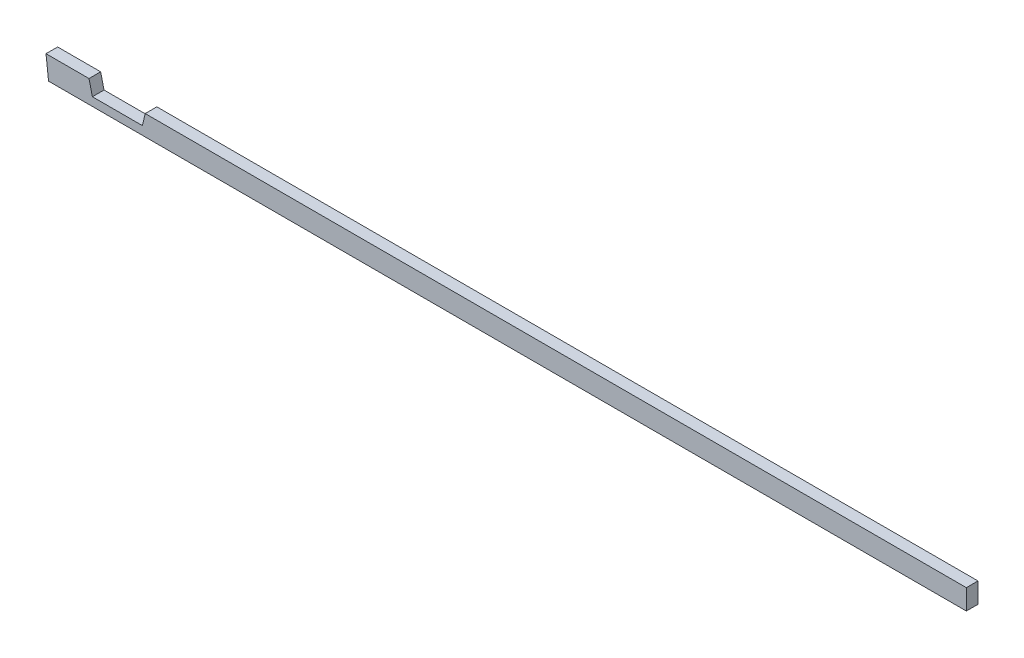
ISO-10303-21;
HEADER;
FILE_DESCRIPTION(('STEP AP214'),'2;1');
FILE_NAME('part.step','',(''),(''),'','','');
FILE_SCHEMA(('AUTOMOTIVE_DESIGN { 1 0 10303 214 1 1 1 1 }'));
ENDSEC;
DATA;
#1=APPLICATION_CONTEXT('core data for automotive mechanical design processes');
#2=APPLICATION_PROTOCOL_DEFINITION('international standard','automotive_design',2000,#1);
#3=PRODUCT_CONTEXT('',#1,'mechanical');
#4=PRODUCT('Part','Part','',(#3));
#5=PRODUCT_RELATED_PRODUCT_CATEGORY('part','',(#4));
#6=PRODUCT_DEFINITION_FORMATION('','',#4);
#7=PRODUCT_DEFINITION_CONTEXT('part definition',#1,'design');
#8=PRODUCT_DEFINITION('design','',#6,#7);
#9=PRODUCT_DEFINITION_SHAPE('','',#8);
#10=(LENGTH_UNIT() NAMED_UNIT(*) SI_UNIT(.MILLI.,.METRE.));
#11=(NAMED_UNIT(*) PLANE_ANGLE_UNIT() SI_UNIT($,.RADIAN.));
#12=(NAMED_UNIT(*) SI_UNIT($,.STERADIAN.) SOLID_ANGLE_UNIT());
#13=UNCERTAINTY_MEASURE_WITH_UNIT(LENGTH_MEASURE(1.E-05),#10,'distance_accuracy_value','');
#14=(GEOMETRIC_REPRESENTATION_CONTEXT(3) GLOBAL_UNCERTAINTY_ASSIGNED_CONTEXT((#13)) GLOBAL_UNIT_ASSIGNED_CONTEXT((#10,
#11,#12)) REPRESENTATION_CONTEXT('',''));
#15=CARTESIAN_POINT('',(0.,0.,0.));
#16=DIRECTION('',(0.,0.,1.));
#17=DIRECTION('',(1.,0.,0.));
#18=AXIS2_PLACEMENT_3D('',#15,#16,#17);
#19=CARTESIAN_POINT('',(686.568618469931,20.4381396888972,9.525));
#20=DIRECTION('',(-1.,0.,0.));
#21=DIRECTION('',(0.,-1.,0.));
#22=AXIS2_PLACEMENT_3D('',#19,#20,#21);
#23=PLANE('',#22);
#24=DIRECTION('',(0.,1.,0.));
#25=VECTOR('',#24,1.);
#26=CARTESIAN_POINT('',(686.568618469931,20.4381396888972,-9.525));
#27=LINE('',#26,#25);
#28=CARTESIAN_POINT('',(686.568618469931,-12.7,-9.525));
#29=VERTEX_POINT('',#28);
#30=CARTESIAN_POINT('',(686.568618469931,20.4381396888972,-9.525));
#31=VERTEX_POINT('',#30);
#32=EDGE_CURVE('E143',#29,#31,#27,.T.);
#33=ORIENTED_EDGE('',*,*,#32,.T.);
#34=DIRECTION('',(0.,0.,-1.));
#35=VECTOR('',#34,1.);
#36=CARTESIAN_POINT('',(686.568618469931,20.4381396888972,9.525));
#37=LINE('',#36,#35);
#38=CARTESIAN_POINT('',(686.568618469931,20.4381396888972,9.525));
#39=VERTEX_POINT('',#38);
#40=EDGE_CURVE('E11',#39,#31,#37,.T.);
#41=ORIENTED_EDGE('',*,*,#40,.F.);
#42=DIRECTION('',(0.,1.,0.));
#43=VECTOR('',#42,1.);
#44=CARTESIAN_POINT('',(686.568618469931,20.4381396888972,9.525));
#45=LINE('',#44,#43);
#46=CARTESIAN_POINT('',(686.568618469931,-12.7,9.525));
#47=VERTEX_POINT('',#46);
#48=EDGE_CURVE('E165',#47,#39,#45,.T.);
#49=ORIENTED_EDGE('',*,*,#48,.F.);
#50=DIRECTION('',(0.,0.,-1.));
#51=VECTOR('',#50,1.);
#52=CARTESIAN_POINT('',(686.568618469931,-12.7,9.525));
#53=LINE('',#52,#51);
#54=EDGE_CURVE('E139',#47,#29,#53,.T.);
#55=ORIENTED_EDGE('',*,*,#54,.T.);
#56=EDGE_LOOP('',(#33,#41,#49,#55));
#57=FACE_BOUND('',#56,.T.);
#58=ADVANCED_FACE('F40',(#57),#23,.F.);
#59=CARTESIAN_POINT('',(-656.565295631087,20.4381396888972,9.525));
#60=DIRECTION('',(0.,-1.,0.));
#61=DIRECTION('',(0.,0.,-1.));
#62=AXIS2_PLACEMENT_3D('',#59,#60,#61);
#63=PLANE('',#62);
#64=DIRECTION('',(-1.,0.,0.));
#65=VECTOR('',#64,1.);
#66=CARTESIAN_POINT('',(-656.565295631087,20.4381396888972,-9.525));
#67=LINE('',#66,#65);
#68=CARTESIAN_POINT('',(-656.565295631087,20.4381396888972,-9.525));
#69=VERTEX_POINT('',#68);
#70=EDGE_CURVE('E147',#31,#69,#67,.T.);
#71=ORIENTED_EDGE('',*,*,#70,.T.);
#72=DIRECTION('',(0.,0.,-1.));
#73=VECTOR('',#72,1.);
#74=CARTESIAN_POINT('',(-656.565295631087,20.4381396888972,9.525));
#75=LINE('',#74,#73);
#76=CARTESIAN_POINT('',(-656.565295631087,20.4381396888972,9.525));
#77=VERTEX_POINT('',#76);
#78=EDGE_CURVE('E49',#77,#69,#75,.T.);
#79=ORIENTED_EDGE('',*,*,#78,.F.);
#80=DIRECTION('',(-1.,0.,0.));
#81=VECTOR('',#80,1.);
#82=CARTESIAN_POINT('',(-656.565295631087,20.4381396888972,9.525));
#83=LINE('',#82,#81);
#84=EDGE_CURVE('E100',#39,#77,#83,.T.);
#85=ORIENTED_EDGE('',*,*,#84,.F.);
#86=ORIENTED_EDGE('',*,*,#40,.T.);
#87=EDGE_LOOP('',(#71,#79,#85,#86));
#88=FACE_BOUND('',#87,.T.);
#89=ADVANCED_FACE('F209',(#88),#63,.F.);
#90=CARTESIAN_POINT('',(-661.093476465157,1.07156984044159,9.525));
#91=DIRECTION('',(0.97373747416586,-0.227673738944771,0.));
#92=DIRECTION('',(0.227673738944771,0.97373747416586,0.));
#93=AXIS2_PLACEMENT_3D('',#90,#91,#92);
#94=PLANE('',#93);
#95=DIRECTION('',(-0.227673738944771,-0.97373747416586,0.));
#96=VECTOR('',#95,1.);
#97=CARTESIAN_POINT('',(-661.093476465157,1.07156984044159,-9.525));
#98=LINE('',#97,#96);
#99=CARTESIAN_POINT('',(-661.093476465157,1.07156984044159,-9.525));
#100=VERTEX_POINT('',#99);
#101=EDGE_CURVE('E150',#69,#100,#98,.T.);
#102=ORIENTED_EDGE('',*,*,#101,.T.);
#103=DIRECTION('',(0.,0.,-1.));
#104=VECTOR('',#103,1.);
#105=CARTESIAN_POINT('',(-661.093476465157,1.07156984044159,9.525));
#106=LINE('',#105,#104);
#107=CARTESIAN_POINT('',(-661.093476465157,1.07156984044159,9.525));
#108=VERTEX_POINT('',#107);
#109=EDGE_CURVE('E176',#108,#100,#106,.T.);
#110=ORIENTED_EDGE('',*,*,#109,.F.);
#111=DIRECTION('',(-0.227673738944771,-0.97373747416586,0.));
#112=VECTOR('',#111,1.);
#113=CARTESIAN_POINT('',(-661.093476465157,1.07156984044159,9.525));
#114=LINE('',#113,#112);
#115=EDGE_CURVE('E186',#77,#108,#114,.T.);
#116=ORIENTED_EDGE('',*,*,#115,.F.);
#117=ORIENTED_EDGE('',*,*,#78,.T.);
#118=EDGE_LOOP('',(#102,#110,#116,#117));
#119=FACE_BOUND('',#118,.T.);
#120=ADVANCED_FACE('F184',(#119),#94,.F.);
#121=CARTESIAN_POINT('',(-742.898264888603,1.07156984044159,9.525));
#122=DIRECTION('',(0.,-1.,0.));
#123=DIRECTION('',(0.,0.,-1.));
#124=AXIS2_PLACEMENT_3D('',#121,#122,#123);
#125=PLANE('',#124);
#126=DIRECTION('',(-1.,0.,0.));
#127=VECTOR('',#126,1.);
#128=CARTESIAN_POINT('',(-742.898264888603,1.07156984044159,-9.525));
#129=LINE('',#128,#127);
#130=CARTESIAN_POINT('',(-742.898264888603,1.07156984044159,-9.525));
#131=VERTEX_POINT('',#130);
#132=EDGE_CURVE('E153',#100,#131,#129,.T.);
#133=ORIENTED_EDGE('',*,*,#132,.T.);
#134=DIRECTION('',(0.,0.,-1.));
#135=VECTOR('',#134,1.);
#136=CARTESIAN_POINT('',(-742.898264888603,1.07156984044159,9.525));
#137=LINE('',#136,#135);
#138=CARTESIAN_POINT('',(-742.898264888603,1.07156984044159,9.525));
#139=VERTEX_POINT('',#138);
#140=EDGE_CURVE('E172',#139,#131,#137,.T.);
#141=ORIENTED_EDGE('',*,*,#140,.F.);
#142=DIRECTION('',(-1.,0.,0.));
#143=VECTOR('',#142,1.);
#144=CARTESIAN_POINT('',(-742.898264888603,1.07156984044159,9.525));
#145=LINE('',#144,#143);
#146=EDGE_CURVE('E199',#108,#139,#145,.T.);
#147=ORIENTED_EDGE('',*,*,#146,.F.);
#148=ORIENTED_EDGE('',*,*,#109,.T.);
#149=EDGE_LOOP('',(#133,#141,#147,#148));
#150=FACE_BOUND('',#149,.T.);
#151=ADVANCED_FACE('F194',(#150),#125,.F.);
#152=CARTESIAN_POINT('',(-742.898264888603,1.07156984044159,9.525));
#153=DIRECTION('',(-0.972310181304351,-0.233694054977655,0.));
#154=DIRECTION('',(0.233694054977655,-0.972310181304351,0.));
#155=AXIS2_PLACEMENT_3D('',#152,#153,#154);
#156=PLANE('',#155);
#157=DIRECTION('',(-0.233694054977655,0.972310181304351,0.));
#158=VECTOR('',#157,1.);
#159=CARTESIAN_POINT('',(-742.898264888603,1.07156984044159,-9.525));
#160=LINE('',#159,#158);
#161=CARTESIAN_POINT('',(-748.440342045687,24.130000000001,-9.525));
#162=VERTEX_POINT('',#161);
#163=EDGE_CURVE('E156',#131,#162,#160,.T.);
#164=ORIENTED_EDGE('',*,*,#163,.T.);
#165=DIRECTION('',(0.,0.,-1.));
#166=VECTOR('',#165,1.);
#167=CARTESIAN_POINT('',(-748.440342045687,24.130000000001,9.525));
#168=LINE('',#167,#166);
#169=CARTESIAN_POINT('',(-748.440342045687,24.130000000001,9.525));
#170=VERTEX_POINT('',#169);
#171=EDGE_CURVE('E130',#170,#162,#168,.T.);
#172=ORIENTED_EDGE('',*,*,#171,.F.);
#173=DIRECTION('',(-0.233694054977655,0.972310181304351,0.));
#174=VECTOR('',#173,1.);
#175=CARTESIAN_POINT('',(-742.898264888603,1.07156984044159,9.525));
#176=LINE('',#175,#174);
#177=EDGE_CURVE('E119',#139,#170,#176,.T.);
#178=ORIENTED_EDGE('',*,*,#177,.F.);
#179=ORIENTED_EDGE('',*,*,#140,.T.);
#180=EDGE_LOOP('',(#164,#172,#178,#179));
#181=FACE_BOUND('',#180,.T.);
#182=ADVANCED_FACE('F197',(#181),#156,.F.);
#183=CARTESIAN_POINT('',(-748.440342045687,24.130000000001,9.525));
#184=DIRECTION('',(0.,-1.,0.));
#185=DIRECTION('',(0.,0.,-1.));
#186=AXIS2_PLACEMENT_3D('',#183,#184,#185);
#187=PLANE('',#186);
#188=DIRECTION('',(-1.,0.,0.));
#189=VECTOR('',#188,1.);
#190=CARTESIAN_POINT('',(-748.440342045687,24.130000000001,-9.525));
#191=LINE('',#190,#189);
#192=CARTESIAN_POINT('',(-818.783998966802,24.130000000001,-9.525));
#193=VERTEX_POINT('',#192);
#194=EDGE_CURVE('E128',#162,#193,#191,.T.);
#195=ORIENTED_EDGE('',*,*,#194,.T.);
#196=DIRECTION('',(0.,0.,-1.));
#197=VECTOR('',#196,1.);
#198=CARTESIAN_POINT('',(-818.783998966802,24.130000000001,9.525));
#199=LINE('',#198,#197);
#200=CARTESIAN_POINT('',(-818.783998966802,24.130000000001,9.525));
#201=VERTEX_POINT('',#200);
#202=EDGE_CURVE('E125',#201,#193,#199,.T.);
#203=ORIENTED_EDGE('',*,*,#202,.F.);
#204=DIRECTION('',(-1.,0.,0.));
#205=VECTOR('',#204,1.);
#206=CARTESIAN_POINT('',(-748.440342045687,24.130000000001,9.525));
#207=LINE('',#206,#205);
#208=EDGE_CURVE('E113',#170,#201,#207,.T.);
#209=ORIENTED_EDGE('',*,*,#208,.F.);
#210=ORIENTED_EDGE('',*,*,#171,.T.);
#211=EDGE_LOOP('',(#195,#203,#209,#210));
#212=FACE_BOUND('',#211,.T.);
#213=ADVANCED_FACE('F126',(#212),#187,.F.);
#214=CARTESIAN_POINT('',(-818.783998966802,24.130000000001,9.525));
#215=DIRECTION('',(0.993564962183844,0.113263700807528,0.));
#216=DIRECTION('',(-0.113263700807528,0.993564962183844,0.));
#217=AXIS2_PLACEMENT_3D('',#214,#215,#216);
#218=PLANE('',#217);
#219=DIRECTION('',(0.113263700807528,-0.993564962183844,0.));
#220=VECTOR('',#219,1.);
#221=CARTESIAN_POINT('',(-818.783998966802,24.130000000001,-9.525));
#222=LINE('',#221,#220);
#223=CARTESIAN_POINT('',(-814.585479232801,-12.7,-9.525));
#224=VERTEX_POINT('',#223);
#225=EDGE_CURVE('E86',#193,#224,#222,.T.);
#226=ORIENTED_EDGE('',*,*,#225,.T.);
#227=DIRECTION('',(0.,0.,-1.));
#228=VECTOR('',#227,1.);
#229=CARTESIAN_POINT('',(-814.585479232801,-12.7,9.525));
#230=LINE('',#229,#228);
#231=CARTESIAN_POINT('',(-814.585479232801,-12.7,9.525));
#232=VERTEX_POINT('',#231);
#233=EDGE_CURVE('E131',#232,#224,#230,.T.);
#234=ORIENTED_EDGE('',*,*,#233,.F.);
#235=DIRECTION('',(0.113263700807528,-0.993564962183844,0.));
#236=VECTOR('',#235,1.);
#237=CARTESIAN_POINT('',(-818.783998966802,24.130000000001,9.525));
#238=LINE('',#237,#236);
#239=EDGE_CURVE('E117',#201,#232,#238,.T.);
#240=ORIENTED_EDGE('',*,*,#239,.F.);
#241=ORIENTED_EDGE('',*,*,#202,.T.);
#242=EDGE_LOOP('',(#226,#234,#240,#241));
#243=FACE_BOUND('',#242,.T.);
#244=ADVANCED_FACE('F133',(#243),#218,.F.);
#245=CARTESIAN_POINT('',(-814.585479232801,-12.7,9.525));
#246=DIRECTION('',(0.,1.,0.));
#247=DIRECTION('',(0.,0.,1.));
#248=AXIS2_PLACEMENT_3D('',#245,#246,#247);
#249=PLANE('',#248);
#250=DIRECTION('',(1.,0.,0.));
#251=VECTOR('',#250,1.);
#252=CARTESIAN_POINT('',(-814.585479232801,-12.7,-9.525));
#253=LINE('',#252,#251);
#254=EDGE_CURVE('E92',#224,#29,#253,.T.);
#255=ORIENTED_EDGE('',*,*,#254,.T.);
#256=ORIENTED_EDGE('',*,*,#54,.F.);
#257=DIRECTION('',(1.,0.,0.));
#258=VECTOR('',#257,1.);
#259=CARTESIAN_POINT('',(-814.585479232801,-12.7,9.525));
#260=LINE('',#259,#258);
#261=EDGE_CURVE('E57',#232,#47,#260,.T.);
#262=ORIENTED_EDGE('',*,*,#261,.F.);
#263=ORIENTED_EDGE('',*,*,#233,.T.);
#264=EDGE_LOOP('',(#255,#256,#262,#263));
#265=FACE_BOUND('',#264,.T.);
#266=ADVANCED_FACE('F225',(#265),#249,.F.);
#267=CARTESIAN_POINT('',(0.,0.,9.525));
#268=DIRECTION('',(0.,0.,1.));
#269=DIRECTION('',(1.,0.,0.));
#270=AXIS2_PLACEMENT_3D('',#267,#268,#269);
#271=PLANE('',#270);
#272=ORIENTED_EDGE('',*,*,#48,.T.);
#273=ORIENTED_EDGE('',*,*,#84,.T.);
#274=ORIENTED_EDGE('',*,*,#115,.T.);
#275=ORIENTED_EDGE('',*,*,#146,.T.);
#276=ORIENTED_EDGE('',*,*,#177,.T.);
#277=ORIENTED_EDGE('',*,*,#208,.T.);
#278=ORIENTED_EDGE('',*,*,#239,.T.);
#279=ORIENTED_EDGE('',*,*,#261,.T.);
#280=EDGE_LOOP('',(#272,#273,#274,#275,#276,#277,#278,#279));
#281=FACE_BOUND('',#280,.T.);
#282=ADVANCED_FACE('F115',(#281),#271,.T.);
#283=CARTESIAN_POINT('',(0.,0.,-9.525));
#284=DIRECTION('',(0.,0.,1.));
#285=DIRECTION('',(1.,0.,0.));
#286=AXIS2_PLACEMENT_3D('',#283,#284,#285);
#287=PLANE('',#286);
#288=ORIENTED_EDGE('',*,*,#32,.F.);
#289=ORIENTED_EDGE('',*,*,#254,.F.);
#290=ORIENTED_EDGE('',*,*,#225,.F.);
#291=ORIENTED_EDGE('',*,*,#194,.F.);
#292=ORIENTED_EDGE('',*,*,#163,.F.);
#293=ORIENTED_EDGE('',*,*,#132,.F.);
#294=ORIENTED_EDGE('',*,*,#101,.F.);
#295=ORIENTED_EDGE('',*,*,#70,.F.);
#296=EDGE_LOOP('',(#288,#289,#290,#291,#292,#293,#294,#295));
#297=FACE_BOUND('',#296,.T.);
#298=ADVANCED_FACE('F190',(#297),#287,.F.);
#299=CLOSED_SHELL('',(#58,#89,#120,#151,#182,#213,#244,#266,#282,#298));
#300=MANIFOLD_SOLID_BREP('B2',#299);
#301=ADVANCED_BREP_SHAPE_REPRESENTATION('',(#18,#300),#14);
#302=SHAPE_DEFINITION_REPRESENTATION(#9,#301);
ENDSEC;
END-ISO-10303-21;
